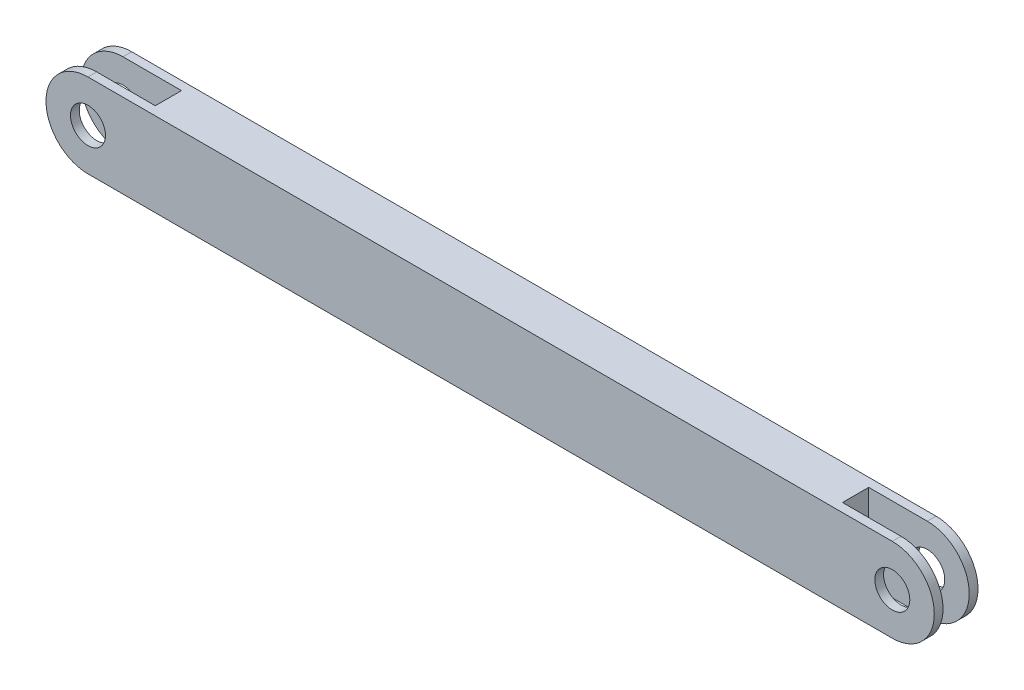
ISO-10303-21;
HEADER;
FILE_DESCRIPTION(('STEP AP214'),'2;1');
FILE_NAME('part.step','',(''),(''),'','','');
FILE_SCHEMA(('AUTOMOTIVE_DESIGN { 1 0 10303 214 1 1 1 1 }'));
ENDSEC;
DATA;
#1=APPLICATION_CONTEXT('core data for automotive mechanical design processes');
#2=APPLICATION_PROTOCOL_DEFINITION('international standard','automotive_design',2000,#1);
#3=PRODUCT_CONTEXT('',#1,'mechanical');
#4=PRODUCT('Part','Part','',(#3));
#5=PRODUCT_RELATED_PRODUCT_CATEGORY('part','',(#4));
#6=PRODUCT_DEFINITION_FORMATION('','',#4);
#7=PRODUCT_DEFINITION_CONTEXT('part definition',#1,'design');
#8=PRODUCT_DEFINITION('design','',#6,#7);
#9=PRODUCT_DEFINITION_SHAPE('','',#8);
#10=(LENGTH_UNIT() NAMED_UNIT(*) SI_UNIT(.MILLI.,.METRE.));
#11=(NAMED_UNIT(*) PLANE_ANGLE_UNIT() SI_UNIT($,.RADIAN.));
#12=(NAMED_UNIT(*) SI_UNIT($,.STERADIAN.) SOLID_ANGLE_UNIT());
#13=UNCERTAINTY_MEASURE_WITH_UNIT(LENGTH_MEASURE(1.E-05),#10,'distance_accuracy_value','');
#14=(GEOMETRIC_REPRESENTATION_CONTEXT(3) GLOBAL_UNCERTAINTY_ASSIGNED_CONTEXT((#13)) GLOBAL_UNIT_ASSIGNED_CONTEXT((#10,
#11,#12)) REPRESENTATION_CONTEXT('',''));
#15=CARTESIAN_POINT('',(0.,0.,0.));
#16=DIRECTION('',(0.,0.,1.));
#17=DIRECTION('',(1.,0.,0.));
#18=AXIS2_PLACEMENT_3D('',#15,#16,#17);
#19=CARTESIAN_POINT('',(230.,1.21808813036139E-10,-25.));
#20=DIRECTION('',(0.,0.,1.));
#21=DIRECTION('',(1.,0.,0.));
#22=AXIS2_PLACEMENT_3D('',#19,#20,#21);
#23=CYLINDRICAL_SURFACE('',#22,24.);
#24=CARTESIAN_POINT('',(230.,1.21808813036139E-10,-20.));
#25=DIRECTION('',(0.,0.,-1.));
#26=DIRECTION('',(-1.,0.,0.));
#27=AXIS2_PLACEMENT_3D('',#24,#25,#26);
#28=CIRCLE('',#27,24.);
#29=CARTESIAN_POINT('',(230.,-24.0000000001007,-20.));
#30=VERTEX_POINT('',#29);
#31=CARTESIAN_POINT('',(230.,24.0000000001218,-20.));
#32=VERTEX_POINT('',#31);
#33=EDGE_CURVE('E183',#30,#32,#28,.F.);
#34=ORIENTED_EDGE('',*,*,#33,.F.);
#35=DIRECTION('',(0.,0.,1.));
#36=VECTOR('',#35,1.);
#37=CARTESIAN_POINT('',(230.,-24.,-25.));
#38=LINE('',#37,#36);
#39=CARTESIAN_POINT('',(230.,-24.,-25.));
#40=VERTEX_POINT('',#39);
#41=EDGE_CURVE('E11',#40,#30,#38,.T.);
#42=ORIENTED_EDGE('',*,*,#41,.F.);
#43=CARTESIAN_POINT('',(230.,1.21808813036139E-10,-25.));
#44=DIRECTION('',(0.,0.,1.));
#45=DIRECTION('',(-1.,0.,0.));
#46=AXIS2_PLACEMENT_3D('',#43,#44,#45);
#47=CIRCLE('',#46,24.);
#48=CARTESIAN_POINT('',(230.,24.,-25.));
#49=VERTEX_POINT('',#48);
#50=EDGE_CURVE('E202',#40,#49,#47,.T.);
#51=ORIENTED_EDGE('',*,*,#50,.T.);
#52=DIRECTION('',(0.,0.,1.));
#53=VECTOR('',#52,1.);
#54=CARTESIAN_POINT('',(230.,24.,-25.));
#55=LINE('',#54,#53);
#56=EDGE_CURVE('E233',#49,#32,#55,.T.);
#57=ORIENTED_EDGE('',*,*,#56,.T.);
#58=EDGE_LOOP('',(#34,#42,#51,#57));
#59=FACE_BOUND('',#58,.T.);
#60=ADVANCED_FACE('F39',(#59),#23,.T.);
#61=CARTESIAN_POINT('',(-230.,-24.,-25.));
#62=DIRECTION('',(0.,-1.,0.));
#63=DIRECTION('',(0.,0.,-1.));
#64=AXIS2_PLACEMENT_3D('',#61,#62,#63);
#65=PLANE('',#64);
#66=DIRECTION('',(0.,0.,1.));
#67=VECTOR('',#66,1.);
#68=CARTESIAN_POINT('',(-230.,-24.0000000001007,-25.));
#69=LINE('',#68,#67);
#70=CARTESIAN_POINT('',(-230.,-24.0000000001007,-5.));
#71=VERTEX_POINT('',#70);
#72=CARTESIAN_POINT('',(-230.,-24.0000000001007,0.));
#73=VERTEX_POINT('',#72);
#74=EDGE_CURVE('E231',#71,#73,#69,.T.);
#75=ORIENTED_EDGE('',*,*,#74,.F.);
#76=DIRECTION('',(1.,0.,0.));
#77=VECTOR('',#76,1.);
#78=CARTESIAN_POINT('',(-263.5,-24.0000000001007,-5.));
#79=LINE('',#78,#77);
#80=CARTESIAN_POINT('',(-196.5,-24.0000000001007,-5.));
#81=VERTEX_POINT('',#80);
#82=EDGE_CURVE('E139',#71,#81,#79,.T.);
#83=ORIENTED_EDGE('',*,*,#82,.T.);
#84=DIRECTION('',(0.,0.,-1.));
#85=VECTOR('',#84,1.);
#86=CARTESIAN_POINT('',(-196.5,-24.0000000001007,-20.));
#87=LINE('',#86,#85);
#88=CARTESIAN_POINT('',(-196.5,-24.0000000001007,-20.));
#89=VERTEX_POINT('',#88);
#90=EDGE_CURVE('E156',#81,#89,#87,.T.);
#91=ORIENTED_EDGE('',*,*,#90,.T.);
#92=DIRECTION('',(-1.,0.,0.));
#93=VECTOR('',#92,1.);
#94=CARTESIAN_POINT('',(-263.5,-24.0000000001007,-20.));
#95=LINE('',#94,#93);
#96=CARTESIAN_POINT('',(-230.,-24.0000000001007,-20.));
#97=VERTEX_POINT('',#96);
#98=EDGE_CURVE('E137',#89,#97,#95,.T.);
#99=ORIENTED_EDGE('',*,*,#98,.T.);
#100=CARTESIAN_POINT('',(-230.,-24.0000000001007,-25.));
#101=VERTEX_POINT('',#100);
#102=EDGE_CURVE('E230',#101,#97,#69,.T.);
#103=ORIENTED_EDGE('',*,*,#102,.F.);
#104=DIRECTION('',(1.,0.,0.));
#105=VECTOR('',#104,1.);
#106=CARTESIAN_POINT('',(-230.,-24.,-25.));
#107=LINE('',#106,#105);
#108=EDGE_CURVE('E212',#101,#40,#107,.T.);
#109=ORIENTED_EDGE('',*,*,#108,.T.);
#110=ORIENTED_EDGE('',*,*,#41,.T.);
#111=DIRECTION('',(-1.,0.,0.));
#112=VECTOR('',#111,1.);
#113=CARTESIAN_POINT('',(263.5,-24.0000000001007,-20.));
#114=LINE('',#113,#112);
#115=CARTESIAN_POINT('',(196.5,-24.0000000001007,-20.));
#116=VERTEX_POINT('',#115);
#117=EDGE_CURVE('E173',#30,#116,#114,.T.);
#118=ORIENTED_EDGE('',*,*,#117,.T.);
#119=DIRECTION('',(0.,0.,1.));
#120=VECTOR('',#119,1.);
#121=CARTESIAN_POINT('',(196.5,-24.0000000001007,-20.));
#122=LINE('',#121,#120);
#123=CARTESIAN_POINT('',(196.5,-24.0000000001007,-5.));
#124=VERTEX_POINT('',#123);
#125=EDGE_CURVE('E174',#116,#124,#122,.T.);
#126=ORIENTED_EDGE('',*,*,#125,.T.);
#127=DIRECTION('',(1.,0.,0.));
#128=VECTOR('',#127,1.);
#129=CARTESIAN_POINT('',(263.5,-24.0000000001007,-5.));
#130=LINE('',#129,#128);
#131=CARTESIAN_POINT('',(230.,-24.0000000001007,-5.));
#132=VERTEX_POINT('',#131);
#133=EDGE_CURVE('E167',#124,#132,#130,.T.);
#134=ORIENTED_EDGE('',*,*,#133,.T.);
#135=CARTESIAN_POINT('',(230.,-24.,0.));
#136=VERTEX_POINT('',#135);
#137=EDGE_CURVE('E48',#132,#136,#38,.T.);
#138=ORIENTED_EDGE('',*,*,#137,.T.);
#139=DIRECTION('',(1.,0.,0.));
#140=VECTOR('',#139,1.);
#141=CARTESIAN_POINT('',(-230.,-24.,0.));
#142=LINE('',#141,#140);
#143=EDGE_CURVE('E207',#73,#136,#142,.T.);
#144=ORIENTED_EDGE('',*,*,#143,.F.);
#145=EDGE_LOOP('',(#75,#83,#91,#99,#103,#109,#110,#118,#126,#134,#138,#144));
#146=FACE_BOUND('',#145,.T.);
#147=ADVANCED_FACE('F260',(#146),#65,.T.);
#148=CARTESIAN_POINT('',(-230.,-1.00672942204838E-10,-25.));
#149=DIRECTION('',(0.,0.,1.));
#150=DIRECTION('',(1.,0.,0.));
#151=AXIS2_PLACEMENT_3D('',#148,#149,#150);
#152=CYLINDRICAL_SURFACE('',#151,24.);
#153=CARTESIAN_POINT('',(-230.,-1.00672942204838E-10,-5.));
#154=DIRECTION('',(0.,0.,1.));
#155=DIRECTION('',(1.,0.,0.));
#156=AXIS2_PLACEMENT_3D('',#153,#154,#155);
#157=CIRCLE('',#156,24.);
#158=CARTESIAN_POINT('',(-230.,24.0000000001218,-5.));
#159=VERTEX_POINT('',#158);
#160=EDGE_CURVE('E187',#71,#159,#157,.F.);
#161=ORIENTED_EDGE('',*,*,#160,.F.);
#162=ORIENTED_EDGE('',*,*,#74,.T.);
#163=CARTESIAN_POINT('',(-230.,-1.00672942204838E-10,0.));
#164=DIRECTION('',(0.,0.,1.));
#165=DIRECTION('',(1.,0.,0.));
#166=AXIS2_PLACEMENT_3D('',#163,#164,#165);
#167=CIRCLE('',#166,24.);
#168=CARTESIAN_POINT('',(-230.,24.,0.));
#169=VERTEX_POINT('',#168);
#170=EDGE_CURVE('E224',#169,#73,#167,.T.);
#171=ORIENTED_EDGE('',*,*,#170,.F.);
#172=DIRECTION('',(0.,0.,1.));
#173=VECTOR('',#172,1.);
#174=CARTESIAN_POINT('',(-230.,24.,-25.));
#175=LINE('',#174,#173);
#176=EDGE_CURVE('E232',#159,#169,#175,.T.);
#177=ORIENTED_EDGE('',*,*,#176,.F.);
#178=EDGE_LOOP('',(#161,#162,#171,#177));
#179=FACE_BOUND('',#178,.T.);
#180=ADVANCED_FACE('F263',(#179),#152,.T.);
#181=CARTESIAN_POINT('',(-230.,0.,-25.));
#182=DIRECTION('',(0.,0.,1.));
#183=DIRECTION('',(1.,0.,0.));
#184=AXIS2_PLACEMENT_3D('',#181,#182,#183);
#185=CYLINDRICAL_SURFACE('',#184,10.);
#186=CARTESIAN_POINT('',(-230.,0.,-5.));
#187=DIRECTION('',(0.,0.,1.));
#188=DIRECTION('',(1.,0.,0.));
#189=AXIS2_PLACEMENT_3D('',#186,#187,#188);
#190=CIRCLE('',#189,10.);
#191=CARTESIAN_POINT('',(-220.,0.,-5.));
#192=VERTEX_POINT('',#191);
#193=EDGE_CURVE('E43',#192,#192,#190,.F.);
#194=ORIENTED_EDGE('',*,*,#193,.T.);
#195=EDGE_LOOP('',(#194));
#196=FACE_BOUND('',#195,.T.);
#197=CARTESIAN_POINT('',(-230.,0.,0.));
#198=DIRECTION('',(0.,0.,1.));
#199=DIRECTION('',(1.,0.,0.));
#200=AXIS2_PLACEMENT_3D('',#197,#198,#199);
#201=CIRCLE('',#200,10.);
#202=CARTESIAN_POINT('',(-220.,0.,0.));
#203=VERTEX_POINT('',#202);
#204=EDGE_CURVE('E198',#203,#203,#201,.T.);
#205=ORIENTED_EDGE('',*,*,#204,.T.);
#206=EDGE_LOOP('',(#205));
#207=FACE_BOUND('',#206,.T.);
#208=ADVANCED_FACE('F280',(#196,#207),#185,.F.);
#209=CARTESIAN_POINT('',(230.,1.21808813036139E-10,-25.));
#210=DIRECTION('',(0.,0.,1.));
#211=DIRECTION('',(1.,0.,0.));
#212=AXIS2_PLACEMENT_3D('',#209,#210,#211);
#213=CYLINDRICAL_SURFACE('',#212,9.99999999996439);
#214=CARTESIAN_POINT('',(230.,1.21808813036139E-10,-20.));
#215=DIRECTION('',(0.,0.,-1.));
#216=DIRECTION('',(-1.,0.,0.));
#217=AXIS2_PLACEMENT_3D('',#214,#215,#216);
#218=CIRCLE('',#217,9.99999999996439);
#219=CARTESIAN_POINT('',(220.000000000036,1.21808813036139E-10,-20.));
#220=VERTEX_POINT('',#219);
#221=EDGE_CURVE('E184',#220,#220,#218,.F.);
#222=ORIENTED_EDGE('',*,*,#221,.T.);
#223=EDGE_LOOP('',(#222));
#224=FACE_BOUND('',#223,.T.);
#225=CARTESIAN_POINT('',(230.,1.21808813036139E-10,-25.));
#226=DIRECTION('',(0.,0.,1.));
#227=DIRECTION('',(-1.,0.,0.));
#228=AXIS2_PLACEMENT_3D('',#225,#226,#227);
#229=CIRCLE('',#228,9.99999999996439);
#230=CARTESIAN_POINT('',(220.000000000036,1.21808813036139E-10,-25.));
#231=VERTEX_POINT('',#230);
#232=EDGE_CURVE('E192',#231,#231,#229,.T.);
#233=ORIENTED_EDGE('',*,*,#232,.F.);
#234=EDGE_LOOP('',(#233));
#235=FACE_BOUND('',#234,.T.);
#236=ADVANCED_FACE('F267',(#224,#235),#213,.F.);
#237=CARTESIAN_POINT('',(230.,1.21808813036139E-10,-5.));
#238=DIRECTION('',(0.,0.,1.));
#239=DIRECTION('',(1.,0.,0.));
#240=AXIS2_PLACEMENT_3D('',#237,#238,#239);
#241=CIRCLE('',#240,24.);
#242=CARTESIAN_POINT('',(230.,24.0000000001218,-5.));
#243=VERTEX_POINT('',#242);
#244=EDGE_CURVE('E185',#243,#132,#241,.F.);
#245=ORIENTED_EDGE('',*,*,#244,.F.);
#246=CARTESIAN_POINT('',(230.,24.,0.));
#247=VERTEX_POINT('',#246);
#248=EDGE_CURVE('E220',#243,#247,#55,.T.);
#249=ORIENTED_EDGE('',*,*,#248,.T.);
#250=CARTESIAN_POINT('',(230.,1.21808813036139E-10,0.));
#251=DIRECTION('',(0.,0.,1.));
#252=DIRECTION('',(-1.,0.,0.));
#253=AXIS2_PLACEMENT_3D('',#250,#251,#252);
#254=CIRCLE('',#253,24.);
#255=EDGE_CURVE('E205',#136,#247,#254,.T.);
#256=ORIENTED_EDGE('',*,*,#255,.F.);
#257=ORIENTED_EDGE('',*,*,#137,.F.);
#258=EDGE_LOOP('',(#245,#249,#256,#257));
#259=FACE_BOUND('',#258,.T.);
#260=ADVANCED_FACE('F41',(#259),#23,.T.);
#261=CARTESIAN_POINT('',(-230.,-1.00672942204838E-10,-20.));
#262=DIRECTION('',(0.,0.,-1.));
#263=DIRECTION('',(-1.,0.,0.));
#264=AXIS2_PLACEMENT_3D('',#261,#262,#263);
#265=CIRCLE('',#264,24.);
#266=CARTESIAN_POINT('',(-230.,24.0000000001218,-20.));
#267=VERTEX_POINT('',#266);
#268=EDGE_CURVE('E190',#267,#97,#265,.F.);
#269=ORIENTED_EDGE('',*,*,#268,.F.);
#270=CARTESIAN_POINT('',(-230.,24.,-25.));
#271=VERTEX_POINT('',#270);
#272=EDGE_CURVE('E153',#271,#267,#175,.T.);
#273=ORIENTED_EDGE('',*,*,#272,.F.);
#274=CARTESIAN_POINT('',(-230.,-1.00672942204838E-10,-25.));
#275=DIRECTION('',(0.,0.,1.));
#276=DIRECTION('',(1.,0.,0.));
#277=AXIS2_PLACEMENT_3D('',#274,#275,#276);
#278=CIRCLE('',#277,24.);
#279=EDGE_CURVE('E211',#271,#101,#278,.T.);
#280=ORIENTED_EDGE('',*,*,#279,.T.);
#281=ORIENTED_EDGE('',*,*,#102,.T.);
#282=EDGE_LOOP('',(#269,#273,#280,#281));
#283=FACE_BOUND('',#282,.T.);
#284=ADVANCED_FACE('F268',(#283),#152,.T.);
#285=CARTESIAN_POINT('',(-230.,24.,-25.));
#286=DIRECTION('',(0.,1.,0.));
#287=DIRECTION('',(0.,0.,1.));
#288=AXIS2_PLACEMENT_3D('',#285,#286,#287);
#289=PLANE('',#288);
#290=DIRECTION('',(-1.,0.,0.));
#291=VECTOR('',#290,1.);
#292=CARTESIAN_POINT('',(263.5,24.0000000001218,-20.));
#293=LINE('',#292,#291);
#294=CARTESIAN_POINT('',(196.5,24.,-20.));
#295=VERTEX_POINT('',#294);
#296=EDGE_CURVE('E150',#32,#295,#293,.T.);
#297=ORIENTED_EDGE('',*,*,#296,.F.);
#298=ORIENTED_EDGE('',*,*,#56,.F.);
#299=DIRECTION('',(-1.,0.,0.));
#300=VECTOR('',#299,1.);
#301=CARTESIAN_POINT('',(-230.,24.,-25.));
#302=LINE('',#301,#300);
#303=EDGE_CURVE('E208',#49,#271,#302,.T.);
#304=ORIENTED_EDGE('',*,*,#303,.T.);
#305=ORIENTED_EDGE('',*,*,#272,.T.);
#306=DIRECTION('',(-1.,0.,0.));
#307=VECTOR('',#306,1.);
#308=CARTESIAN_POINT('',(-263.5,24.0000000001218,-20.));
#309=LINE('',#308,#307);
#310=CARTESIAN_POINT('',(-196.5,24.0000000001218,-20.));
#311=VERTEX_POINT('',#310);
#312=EDGE_CURVE('E132',#311,#267,#309,.T.);
#313=ORIENTED_EDGE('',*,*,#312,.F.);
#314=DIRECTION('',(0.,0.,-1.));
#315=VECTOR('',#314,1.);
#316=CARTESIAN_POINT('',(-196.5,24.0000000001218,-20.));
#317=LINE('',#316,#315);
#318=CARTESIAN_POINT('',(-196.5,24.,-5.));
#319=VERTEX_POINT('',#318);
#320=EDGE_CURVE('E141',#319,#311,#317,.T.);
#321=ORIENTED_EDGE('',*,*,#320,.F.);
#322=DIRECTION('',(1.,0.,0.));
#323=VECTOR('',#322,1.);
#324=CARTESIAN_POINT('',(-263.5,24.0000000001218,-5.));
#325=LINE('',#324,#323);
#326=EDGE_CURVE('E152',#159,#319,#325,.T.);
#327=ORIENTED_EDGE('',*,*,#326,.F.);
#328=ORIENTED_EDGE('',*,*,#176,.T.);
#329=DIRECTION('',(-1.,0.,0.));
#330=VECTOR('',#329,1.);
#331=CARTESIAN_POINT('',(-230.,24.,0.));
#332=LINE('',#331,#330);
#333=EDGE_CURVE('E219',#247,#169,#332,.T.);
#334=ORIENTED_EDGE('',*,*,#333,.F.);
#335=ORIENTED_EDGE('',*,*,#248,.F.);
#336=DIRECTION('',(1.,0.,0.));
#337=VECTOR('',#336,1.);
#338=CARTESIAN_POINT('',(263.5,24.0000000001218,-5.));
#339=LINE('',#338,#337);
#340=CARTESIAN_POINT('',(196.5,24.0000000001218,-5.));
#341=VERTEX_POINT('',#340);
#342=EDGE_CURVE('E180',#341,#243,#339,.T.);
#343=ORIENTED_EDGE('',*,*,#342,.F.);
#344=DIRECTION('',(0.,0.,1.));
#345=VECTOR('',#344,1.);
#346=CARTESIAN_POINT('',(196.5,24.0000000001218,-20.));
#347=LINE('',#346,#345);
#348=EDGE_CURVE('E178',#295,#341,#347,.T.);
#349=ORIENTED_EDGE('',*,*,#348,.F.);
#350=EDGE_LOOP('',(#297,#298,#304,#305,#313,#321,#327,#328,#334,#335,#343,#349));
#351=FACE_BOUND('',#350,.T.);
#352=ADVANCED_FACE('F151',(#351),#289,.T.);
#353=CARTESIAN_POINT('',(230.,1.21808813036139E-10,-25.));
#354=DIRECTION('',(0.,0.,-1.));
#355=DIRECTION('',(-1.,0.,0.));
#356=AXIS2_PLACEMENT_3D('',#353,#354,#355);
#357=PLANE('',#356);
#358=ORIENTED_EDGE('',*,*,#232,.T.);
#359=EDGE_LOOP('',(#358));
#360=FACE_BOUND('',#359,.T.);
#361=CARTESIAN_POINT('',(-230.,0.,-25.));
#362=DIRECTION('',(0.,0.,1.));
#363=DIRECTION('',(1.,0.,0.));
#364=AXIS2_PLACEMENT_3D('',#361,#362,#363);
#365=CIRCLE('',#364,10.);
#366=CARTESIAN_POINT('',(-220.,0.,-25.));
#367=VERTEX_POINT('',#366);
#368=EDGE_CURVE('E200',#367,#367,#365,.T.);
#369=ORIENTED_EDGE('',*,*,#368,.T.);
#370=EDGE_LOOP('',(#369));
#371=FACE_BOUND('',#370,.T.);
#372=ORIENTED_EDGE('',*,*,#50,.F.);
#373=ORIENTED_EDGE('',*,*,#108,.F.);
#374=ORIENTED_EDGE('',*,*,#279,.F.);
#375=ORIENTED_EDGE('',*,*,#303,.F.);
#376=EDGE_LOOP('',(#372,#373,#374,#375));
#377=FACE_BOUND('',#376,.T.);
#378=ADVANCED_FACE('F302',(#360,#371,#377),#357,.T.);
#379=CARTESIAN_POINT('',(230.,1.21808813036139E-10,0.));
#380=DIRECTION('',(0.,0.,-1.));
#381=DIRECTION('',(-1.,0.,0.));
#382=AXIS2_PLACEMENT_3D('',#379,#380,#381);
#383=PLANE('',#382);
#384=CARTESIAN_POINT('',(230.,1.21808813036139E-10,0.));
#385=DIRECTION('',(0.,0.,1.));
#386=DIRECTION('',(-1.,0.,0.));
#387=AXIS2_PLACEMENT_3D('',#384,#385,#386);
#388=CIRCLE('',#387,9.99999999996439);
#389=CARTESIAN_POINT('',(220.000000000036,1.21808813036139E-10,0.));
#390=VERTEX_POINT('',#389);
#391=EDGE_CURVE('E195',#390,#390,#388,.T.);
#392=ORIENTED_EDGE('',*,*,#391,.F.);
#393=EDGE_LOOP('',(#392));
#394=FACE_BOUND('',#393,.T.);
#395=ORIENTED_EDGE('',*,*,#204,.F.);
#396=EDGE_LOOP('',(#395));
#397=FACE_BOUND('',#396,.T.);
#398=ORIENTED_EDGE('',*,*,#255,.T.);
#399=ORIENTED_EDGE('',*,*,#333,.T.);
#400=ORIENTED_EDGE('',*,*,#170,.T.);
#401=ORIENTED_EDGE('',*,*,#143,.T.);
#402=EDGE_LOOP('',(#398,#399,#400,#401));
#403=FACE_BOUND('',#402,.T.);
#404=ADVANCED_FACE('F291',(#394,#397,#403),#383,.F.);
#405=CARTESIAN_POINT('',(-230.,0.,-20.));
#406=DIRECTION('',(0.,0.,-1.));
#407=DIRECTION('',(-1.,0.,0.));
#408=AXIS2_PLACEMENT_3D('',#405,#406,#407);
#409=CIRCLE('',#408,10.);
#410=CARTESIAN_POINT('',(-240.,0.,-20.));
#411=VERTEX_POINT('',#410);
#412=EDGE_CURVE('E186',#411,#411,#409,.F.);
#413=ORIENTED_EDGE('',*,*,#412,.T.);
#414=EDGE_LOOP('',(#413));
#415=FACE_BOUND('',#414,.T.);
#416=ORIENTED_EDGE('',*,*,#368,.F.);
#417=EDGE_LOOP('',(#416));
#418=FACE_BOUND('',#417,.T.);
#419=ADVANCED_FACE('F245',(#415,#418),#185,.F.);
#420=CARTESIAN_POINT('',(230.,1.21808813036139E-10,-5.));
#421=DIRECTION('',(0.,0.,1.));
#422=DIRECTION('',(1.,0.,0.));
#423=AXIS2_PLACEMENT_3D('',#420,#421,#422);
#424=CIRCLE('',#423,9.99999999996439);
#425=CARTESIAN_POINT('',(239.999999999964,1.21808813036139E-10,-5.));
#426=VERTEX_POINT('',#425);
#427=EDGE_CURVE('E162',#426,#426,#424,.F.);
#428=ORIENTED_EDGE('',*,*,#427,.T.);
#429=EDGE_LOOP('',(#428));
#430=FACE_BOUND('',#429,.T.);
#431=ORIENTED_EDGE('',*,*,#391,.T.);
#432=EDGE_LOOP('',(#431));
#433=FACE_BOUND('',#432,.T.);
#434=ADVANCED_FACE('F278',(#430,#433),#213,.F.);
#435=CARTESIAN_POINT('',(263.5,-24.0000000001007,-20.));
#436=DIRECTION('',(0.,0.,-1.));
#437=DIRECTION('',(-1.,0.,0.));
#438=AXIS2_PLACEMENT_3D('',#435,#436,#437);
#439=PLANE('',#438);
#440=ORIENTED_EDGE('',*,*,#33,.T.);
#441=ORIENTED_EDGE('',*,*,#296,.T.);
#442=DIRECTION('',(0.,1.,0.));
#443=VECTOR('',#442,1.);
#444=CARTESIAN_POINT('',(196.5,-24.0000000001007,-20.));
#445=LINE('',#444,#443);
#446=EDGE_CURVE('E63',#116,#295,#445,.T.);
#447=ORIENTED_EDGE('',*,*,#446,.F.);
#448=ORIENTED_EDGE('',*,*,#117,.F.);
#449=EDGE_LOOP('',(#440,#441,#447,#448));
#450=FACE_BOUND('',#449,.T.);
#451=ORIENTED_EDGE('',*,*,#221,.F.);
#452=EDGE_LOOP('',(#451));
#453=FACE_BOUND('',#452,.T.);
#454=ADVANCED_FACE('F327',(#450,#453),#439,.F.);
#455=CARTESIAN_POINT('',(263.5,-24.0000000001007,-5.));
#456=DIRECTION('',(0.,0.,1.));
#457=DIRECTION('',(1.,0.,0.));
#458=AXIS2_PLACEMENT_3D('',#455,#456,#457);
#459=PLANE('',#458);
#460=ORIENTED_EDGE('',*,*,#244,.T.);
#461=ORIENTED_EDGE('',*,*,#133,.F.);
#462=DIRECTION('',(0.,1.,0.));
#463=VECTOR('',#462,1.);
#464=CARTESIAN_POINT('',(196.5,-24.0000000001007,-5.));
#465=LINE('',#464,#463);
#466=EDGE_CURVE('E170',#124,#341,#465,.T.);
#467=ORIENTED_EDGE('',*,*,#466,.T.);
#468=ORIENTED_EDGE('',*,*,#342,.T.);
#469=EDGE_LOOP('',(#460,#461,#467,#468));
#470=FACE_BOUND('',#469,.T.);
#471=ORIENTED_EDGE('',*,*,#427,.F.);
#472=EDGE_LOOP('',(#471));
#473=FACE_BOUND('',#472,.T.);
#474=ADVANCED_FACE('F299',(#470,#473),#459,.F.);
#475=CARTESIAN_POINT('',(196.5,-24.0000000001007,-20.));
#476=DIRECTION('',(-1.,0.,0.));
#477=DIRECTION('',(0.,0.,1.));
#478=AXIS2_PLACEMENT_3D('',#475,#476,#477);
#479=PLANE('',#478);
#480=ORIENTED_EDGE('',*,*,#466,.F.);
#481=ORIENTED_EDGE('',*,*,#125,.F.);
#482=ORIENTED_EDGE('',*,*,#446,.T.);
#483=ORIENTED_EDGE('',*,*,#348,.T.);
#484=EDGE_LOOP('',(#480,#481,#482,#483));
#485=FACE_BOUND('',#484,.T.);
#486=ADVANCED_FACE('F251',(#485),#479,.F.);
#487=CARTESIAN_POINT('',(-263.5,-24.0000000001007,-5.));
#488=DIRECTION('',(0.,0.,1.));
#489=DIRECTION('',(1.,0.,0.));
#490=AXIS2_PLACEMENT_3D('',#487,#488,#489);
#491=PLANE('',#490);
#492=ORIENTED_EDGE('',*,*,#160,.T.);
#493=ORIENTED_EDGE('',*,*,#326,.T.);
#494=DIRECTION('',(0.,1.,0.));
#495=VECTOR('',#494,1.);
#496=CARTESIAN_POINT('',(-196.5,-24.0000000001007,-5.));
#497=LINE('',#496,#495);
#498=EDGE_CURVE('E57',#81,#319,#497,.T.);
#499=ORIENTED_EDGE('',*,*,#498,.F.);
#500=ORIENTED_EDGE('',*,*,#82,.F.);
#501=EDGE_LOOP('',(#492,#493,#499,#500));
#502=FACE_BOUND('',#501,.T.);
#503=ORIENTED_EDGE('',*,*,#193,.F.);
#504=EDGE_LOOP('',(#503));
#505=FACE_BOUND('',#504,.T.);
#506=ADVANCED_FACE('F246',(#502,#505),#491,.F.);
#507=CARTESIAN_POINT('',(-263.5,-24.0000000001007,-20.));
#508=DIRECTION('',(0.,0.,-1.));
#509=DIRECTION('',(-1.,0.,0.));
#510=AXIS2_PLACEMENT_3D('',#507,#508,#509);
#511=PLANE('',#510);
#512=ORIENTED_EDGE('',*,*,#268,.T.);
#513=ORIENTED_EDGE('',*,*,#98,.F.);
#514=DIRECTION('',(0.,1.,0.));
#515=VECTOR('',#514,1.);
#516=CARTESIAN_POINT('',(-196.5,-24.0000000001007,-20.));
#517=LINE('',#516,#515);
#518=EDGE_CURVE('E134',#89,#311,#517,.T.);
#519=ORIENTED_EDGE('',*,*,#518,.T.);
#520=ORIENTED_EDGE('',*,*,#312,.T.);
#521=EDGE_LOOP('',(#512,#513,#519,#520));
#522=FACE_BOUND('',#521,.T.);
#523=ORIENTED_EDGE('',*,*,#412,.F.);
#524=EDGE_LOOP('',(#523));
#525=FACE_BOUND('',#524,.T.);
#526=ADVANCED_FACE('F131',(#522,#525),#511,.F.);
#527=CARTESIAN_POINT('',(-196.5,-24.0000000001007,-20.));
#528=DIRECTION('',(1.,0.,0.));
#529=DIRECTION('',(0.,0.,-1.));
#530=AXIS2_PLACEMENT_3D('',#527,#528,#529);
#531=PLANE('',#530);
#532=ORIENTED_EDGE('',*,*,#518,.F.);
#533=ORIENTED_EDGE('',*,*,#90,.F.);
#534=ORIENTED_EDGE('',*,*,#498,.T.);
#535=ORIENTED_EDGE('',*,*,#320,.T.);
#536=EDGE_LOOP('',(#532,#533,#534,#535));
#537=FACE_BOUND('',#536,.T.);
#538=ADVANCED_FACE('F145',(#537),#531,.F.);
#539=CLOSED_SHELL('',(#60,#147,#180,#208,#236,#260,#284,#352,#378,#404,#419,#434,#454,#474,#486,
#506,#526,#538));
#540=MANIFOLD_SOLID_BREP('B2',#539);
#541=ADVANCED_BREP_SHAPE_REPRESENTATION('',(#18,#540),#14);
#542=SHAPE_DEFINITION_REPRESENTATION(#9,#541);
ENDSEC;
END-ISO-10303-21;
